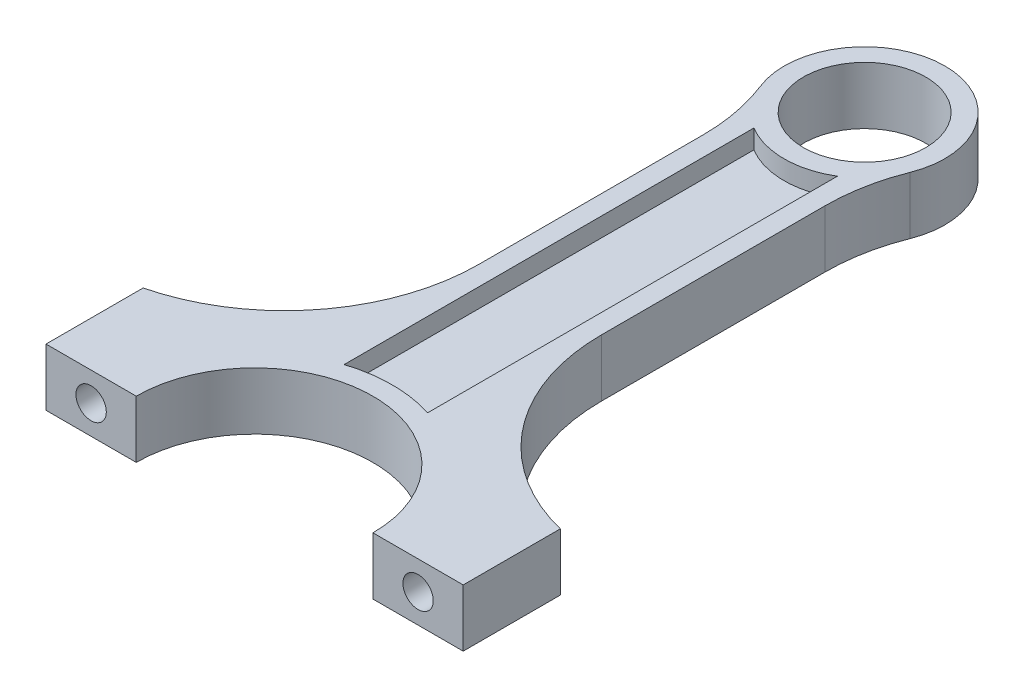
ISO-10303-21;
HEADER;
FILE_DESCRIPTION(('STEP AP214'),'2;1');
FILE_NAME('part.step','',(''),(''),'','','');
FILE_SCHEMA(('AUTOMOTIVE_DESIGN { 1 0 10303 214 1 1 1 1 }'));
ENDSEC;
DATA;
#1=APPLICATION_CONTEXT('core data for automotive mechanical design processes');
#2=APPLICATION_PROTOCOL_DEFINITION('international standard','automotive_design',2000,#1);
#3=PRODUCT_CONTEXT('',#1,'mechanical');
#4=PRODUCT('Part','Part','',(#3));
#5=PRODUCT_RELATED_PRODUCT_CATEGORY('part','',(#4));
#6=PRODUCT_DEFINITION_FORMATION('','',#4);
#7=PRODUCT_DEFINITION_CONTEXT('part definition',#1,'design');
#8=PRODUCT_DEFINITION('design','',#6,#7);
#9=PRODUCT_DEFINITION_SHAPE('','',#8);
#10=(LENGTH_UNIT() NAMED_UNIT(*) SI_UNIT(.MILLI.,.METRE.));
#11=(NAMED_UNIT(*) PLANE_ANGLE_UNIT() SI_UNIT($,.RADIAN.));
#12=(NAMED_UNIT(*) SI_UNIT($,.STERADIAN.) SOLID_ANGLE_UNIT());
#13=UNCERTAINTY_MEASURE_WITH_UNIT(LENGTH_MEASURE(1.E-05),#10,'distance_accuracy_value','');
#14=(GEOMETRIC_REPRESENTATION_CONTEXT(3) GLOBAL_UNCERTAINTY_ASSIGNED_CONTEXT((#13)) GLOBAL_UNIT_ASSIGNED_CONTEXT((#10,
#11,#12)) REPRESENTATION_CONTEXT('',''));
#15=CARTESIAN_POINT('',(0.,0.,0.));
#16=DIRECTION('',(0.,0.,1.));
#17=DIRECTION('',(1.,0.,0.));
#18=AXIS2_PLACEMENT_3D('',#15,#16,#17);
#19=CARTESIAN_POINT('',(0.,0.,0.));
#20=DIRECTION('',(0.,0.,1.));
#21=DIRECTION('',(1.,0.,0.));
#22=AXIS2_PLACEMENT_3D('',#19,#20,#21);
#23=PLANE('',#22);
#24=CARTESIAN_POINT('',(-42.7563512142864,0.,0.));
#25=DIRECTION('',(0.,0.,1.));
#26=DIRECTION('',(1.,0.,0.));
#27=AXIS2_PLACEMENT_3D('',#24,#25,#26);
#28=CIRCLE('',#27,3.96874999999999);
#29=CARTESIAN_POINT('',(-38.7876012142864,0.,0.));
#30=VERTEX_POINT('',#29);
#31=EDGE_CURVE('E194',#30,#30,#28,.T.);
#32=ORIENTED_EDGE('',*,*,#31,.F.);
#33=EDGE_LOOP('',(#32));
#34=FACE_BOUND('',#33,.T.);
#35=DIRECTION('',(0.,-1.,0.));
#36=VECTOR('',#35,1.);
#37=CARTESIAN_POINT('',(-54.5564524285727,-7.5057,0.));
#38=LINE('',#37,#36);
#39=CARTESIAN_POINT('',(-54.5564524285727,7.5057,0.));
#40=VERTEX_POINT('',#39);
#41=CARTESIAN_POINT('',(-54.5564524285727,-7.5057,0.));
#42=VERTEX_POINT('',#41);
#43=EDGE_CURVE('E333',#40,#42,#38,.T.);
#44=ORIENTED_EDGE('',*,*,#43,.T.);
#45=DIRECTION('',(1.,0.,0.));
#46=VECTOR('',#45,1.);
#47=CARTESIAN_POINT('',(0.,-7.5057,0.));
#48=LINE('',#47,#46);
#49=CARTESIAN_POINT('',(-30.95625,-7.5057,0.));
#50=VERTEX_POINT('',#49);
#51=EDGE_CURVE('E342',#42,#50,#48,.T.);
#52=ORIENTED_EDGE('',*,*,#51,.T.);
#53=DIRECTION('',(0.,1.,0.));
#54=VECTOR('',#53,1.);
#55=CARTESIAN_POINT('',(-30.95625,-7.5057,0.));
#56=LINE('',#55,#54);
#57=CARTESIAN_POINT('',(-30.95625,7.5057,0.));
#58=VERTEX_POINT('',#57);
#59=EDGE_CURVE('E339',#50,#58,#56,.T.);
#60=ORIENTED_EDGE('',*,*,#59,.T.);
#61=DIRECTION('',(1.,0.,0.));
#62=VECTOR('',#61,1.);
#63=CARTESIAN_POINT('',(0.,7.5057,0.));
#64=LINE('',#63,#62);
#65=EDGE_CURVE('E329',#40,#58,#64,.T.);
#66=ORIENTED_EDGE('',*,*,#65,.F.);
#67=EDGE_LOOP('',(#44,#52,#60,#66));
#68=FACE_BOUND('',#67,.T.);
#69=ADVANCED_FACE('F35',(#34,#68),#23,.T.);
#70=CARTESIAN_POINT('',(42.7563512142864,0.,0.));
#71=DIRECTION('',(0.,0.,1.));
#72=DIRECTION('',(1.,0.,0.));
#73=AXIS2_PLACEMENT_3D('',#70,#71,#72);
#74=CIRCLE('',#73,3.96874999999999);
#75=CARTESIAN_POINT('',(46.7251012142864,0.,0.));
#76=VERTEX_POINT('',#75);
#77=EDGE_CURVE('E193',#76,#76,#74,.T.);
#78=ORIENTED_EDGE('',*,*,#77,.F.);
#79=EDGE_LOOP('',(#78));
#80=FACE_BOUND('',#79,.T.);
#81=DIRECTION('',(0.,1.,0.));
#82=VECTOR('',#81,1.);
#83=CARTESIAN_POINT('',(30.95625,-7.5057,0.));
#84=LINE('',#83,#82);
#85=CARTESIAN_POINT('',(30.95625,7.5057,0.));
#86=VERTEX_POINT('',#85);
#87=CARTESIAN_POINT('',(30.95625,-7.5057,0.));
#88=VERTEX_POINT('',#87);
#89=EDGE_CURVE('E336',#86,#88,#84,.F.);
#90=ORIENTED_EDGE('',*,*,#89,.T.);
#91=CARTESIAN_POINT('',(54.5564524285727,-7.5057,0.));
#92=VERTEX_POINT('',#91);
#93=EDGE_CURVE('E204',#88,#92,#48,.T.);
#94=ORIENTED_EDGE('',*,*,#93,.T.);
#95=DIRECTION('',(0.,-1.,0.));
#96=VECTOR('',#95,1.);
#97=CARTESIAN_POINT('',(54.5564524285727,-7.5057,0.));
#98=LINE('',#97,#96);
#99=CARTESIAN_POINT('',(54.5564524285727,7.5057,0.));
#100=VERTEX_POINT('',#99);
#101=EDGE_CURVE('E330',#100,#92,#98,.T.);
#102=ORIENTED_EDGE('',*,*,#101,.F.);
#103=EDGE_CURVE('E224',#86,#100,#64,.T.);
#104=ORIENTED_EDGE('',*,*,#103,.F.);
#105=EDGE_LOOP('',(#90,#94,#102,#104));
#106=FACE_BOUND('',#105,.T.);
#107=ADVANCED_FACE('F382',(#80,#106),#23,.T.);
#108=CARTESIAN_POINT('',(0.,-2.54,0.));
#109=DIRECTION('',(0.,1.,0.));
#110=DIRECTION('',(0.,0.,1.));
#111=AXIS2_PLACEMENT_3D('',#108,#109,#110);
#112=PLANE('',#111);
#113=CARTESIAN_POINT('',(0.,-2.54,0.));
#114=DIRECTION('',(0.,1.,0.));
#115=DIRECTION('',(0.,0.,1.));
#116=AXIS2_PLACEMENT_3D('',#113,#114,#115);
#117=CIRCLE('',#116,36.03625);
#118=CARTESIAN_POINT('',(10.922,-2.54,-34.3412467750153));
#119=VERTEX_POINT('',#118);
#120=CARTESIAN_POINT('',(-10.922,-2.54,-34.3412467750153));
#121=VERTEX_POINT('',#120);
#122=EDGE_CURVE('E317',#119,#121,#117,.T.);
#123=ORIENTED_EDGE('',*,*,#122,.T.);
#124=DIRECTION('',(0.,0.,1.));
#125=VECTOR('',#124,1.);
#126=CARTESIAN_POINT('',(-10.922,-2.54,0.));
#127=LINE('',#126,#125);
#128=CARTESIAN_POINT('',(-10.922,-2.54,-141.511538821112));
#129=VERTEX_POINT('',#128);
#130=EDGE_CURVE('E72',#129,#121,#127,.T.);
#131=ORIENTED_EDGE('',*,*,#130,.F.);
#132=CARTESIAN_POINT('',(0.,-2.54,-159.54375));
#133=DIRECTION('',(0.,1.,0.));
#134=DIRECTION('',(0.,0.,1.));
#135=AXIS2_PLACEMENT_3D('',#132,#133,#134);
#136=CIRCLE('',#135,21.082);
#137=CARTESIAN_POINT('',(10.922,-2.54,-141.511538821112));
#138=VERTEX_POINT('',#137);
#139=EDGE_CURVE('E322',#129,#138,#136,.T.);
#140=ORIENTED_EDGE('',*,*,#139,.T.);
#141=DIRECTION('',(0.,0.,-1.));
#142=VECTOR('',#141,1.);
#143=CARTESIAN_POINT('',(10.922,-2.54,0.));
#144=LINE('',#143,#142);
#145=EDGE_CURVE('E308',#119,#138,#144,.T.);
#146=ORIENTED_EDGE('',*,*,#145,.F.);
#147=EDGE_LOOP('',(#123,#131,#140,#146));
#148=FACE_BOUND('',#147,.T.);
#149=ADVANCED_FACE('F413',(#148),#112,.F.);
#150=CARTESIAN_POINT('',(0.,2.54,0.));
#151=DIRECTION('',(0.,1.,0.));
#152=DIRECTION('',(0.,0.,1.));
#153=AXIS2_PLACEMENT_3D('',#150,#151,#152);
#154=PLANE('',#153);
#155=CARTESIAN_POINT('',(0.,2.54,0.));
#156=DIRECTION('',(0.,-1.,0.));
#157=DIRECTION('',(0.,0.,1.));
#158=AXIS2_PLACEMENT_3D('',#155,#156,#157);
#159=CIRCLE('',#158,36.03625);
#160=CARTESIAN_POINT('',(-10.922,2.54,-34.3412467750153));
#161=VERTEX_POINT('',#160);
#162=CARTESIAN_POINT('',(10.922,2.54,-34.3412467750153));
#163=VERTEX_POINT('',#162);
#164=EDGE_CURVE('E288',#161,#163,#159,.T.);
#165=ORIENTED_EDGE('',*,*,#164,.T.);
#166=DIRECTION('',(0.,0.,-1.));
#167=VECTOR('',#166,1.);
#168=CARTESIAN_POINT('',(10.922,2.54,-141.511538821112));
#169=LINE('',#168,#167);
#170=CARTESIAN_POINT('',(10.922,2.54,-141.511538821112));
#171=VERTEX_POINT('',#170);
#172=EDGE_CURVE('E301',#163,#171,#169,.T.);
#173=ORIENTED_EDGE('',*,*,#172,.T.);
#174=CARTESIAN_POINT('',(0.,2.54,-159.54375));
#175=DIRECTION('',(0.,-1.,0.));
#176=DIRECTION('',(0.,0.,1.));
#177=AXIS2_PLACEMENT_3D('',#174,#175,#176);
#178=CIRCLE('',#177,21.082);
#179=CARTESIAN_POINT('',(-10.922,2.54,-141.511538821112));
#180=VERTEX_POINT('',#179);
#181=EDGE_CURVE('E298',#171,#180,#178,.T.);
#182=ORIENTED_EDGE('',*,*,#181,.T.);
#183=DIRECTION('',(0.,0.,1.));
#184=VECTOR('',#183,1.);
#185=CARTESIAN_POINT('',(-10.922,2.54,-34.3412467750153));
#186=LINE('',#185,#184);
#187=EDGE_CURVE('E278',#180,#161,#186,.T.);
#188=ORIENTED_EDGE('',*,*,#187,.T.);
#189=EDGE_LOOP('',(#165,#173,#182,#188));
#190=FACE_BOUND('',#189,.T.);
#191=ADVANCED_FACE('F415',(#190),#154,.T.);
#192=CARTESIAN_POINT('',(0.,-2.54,-159.54375));
#193=DIRECTION('',(0.,-1.,0.));
#194=DIRECTION('',(0.,0.,-1.));
#195=AXIS2_PLACEMENT_3D('',#192,#193,#194);
#196=CYLINDRICAL_SURFACE('',#195,21.082);
#197=CARTESIAN_POINT('',(0.,-7.5057,-159.54375));
#198=DIRECTION('',(0.,1.,0.));
#199=DIRECTION('',(0.,0.,1.));
#200=AXIS2_PLACEMENT_3D('',#197,#198,#199);
#201=CIRCLE('',#200,21.082);
#202=CARTESIAN_POINT('',(-10.922,-7.5057,-141.511538821112));
#203=VERTEX_POINT('',#202);
#204=CARTESIAN_POINT('',(10.922,-7.5057,-141.511538821112));
#205=VERTEX_POINT('',#204);
#206=EDGE_CURVE('E316',#203,#205,#201,.T.);
#207=ORIENTED_EDGE('',*,*,#206,.T.);
#208=DIRECTION('',(0.,-1.,0.));
#209=VECTOR('',#208,1.);
#210=CARTESIAN_POINT('',(10.922,-2.54,-141.511538821112));
#211=LINE('',#210,#209);
#212=EDGE_CURVE('E310',#138,#205,#211,.T.);
#213=ORIENTED_EDGE('',*,*,#212,.F.);
#214=ORIENTED_EDGE('',*,*,#139,.F.);
#215=DIRECTION('',(0.,-1.,0.));
#216=VECTOR('',#215,1.);
#217=CARTESIAN_POINT('',(-10.922,-2.54,-141.511538821112));
#218=LINE('',#217,#216);
#219=EDGE_CURVE('E54',#129,#203,#218,.T.);
#220=ORIENTED_EDGE('',*,*,#219,.T.);
#221=EDGE_LOOP('',(#207,#213,#214,#220));
#222=FACE_BOUND('',#221,.T.);
#223=ADVANCED_FACE('F422',(#222),#196,.T.);
#224=CARTESIAN_POINT('',(10.922,-2.54,0.));
#225=DIRECTION('',(-1.,0.,0.));
#226=DIRECTION('',(0.,0.,1.));
#227=AXIS2_PLACEMENT_3D('',#224,#225,#226);
#228=PLANE('',#227);
#229=DIRECTION('',(0.,0.,-1.));
#230=VECTOR('',#229,1.);
#231=CARTESIAN_POINT('',(10.922,-7.5057,0.));
#232=LINE('',#231,#230);
#233=CARTESIAN_POINT('',(10.922,-7.5057,-34.3412467750153));
#234=VERTEX_POINT('',#233);
#235=EDGE_CURVE('E313',#234,#205,#232,.T.);
#236=ORIENTED_EDGE('',*,*,#235,.F.);
#237=DIRECTION('',(0.,-1.,0.));
#238=VECTOR('',#237,1.);
#239=CARTESIAN_POINT('',(10.922,-2.54,-34.3412467750153));
#240=LINE('',#239,#238);
#241=EDGE_CURVE('E77',#119,#234,#240,.T.);
#242=ORIENTED_EDGE('',*,*,#241,.F.);
#243=ORIENTED_EDGE('',*,*,#145,.T.);
#244=ORIENTED_EDGE('',*,*,#212,.T.);
#245=EDGE_LOOP('',(#236,#242,#243,#244));
#246=FACE_BOUND('',#245,.T.);
#247=ADVANCED_FACE('F429',(#246),#228,.T.);
#248=CARTESIAN_POINT('',(0.,-2.54,0.));
#249=DIRECTION('',(0.,-1.,0.));
#250=DIRECTION('',(0.,0.,-1.));
#251=AXIS2_PLACEMENT_3D('',#248,#249,#250);
#252=CYLINDRICAL_SURFACE('',#251,36.03625);
#253=CARTESIAN_POINT('',(0.,-7.5057,0.));
#254=DIRECTION('',(0.,1.,0.));
#255=DIRECTION('',(0.,0.,1.));
#256=AXIS2_PLACEMENT_3D('',#253,#254,#255);
#257=CIRCLE('',#256,36.03625);
#258=CARTESIAN_POINT('',(-10.922,-7.5057,-34.3412467750153));
#259=VERTEX_POINT('',#258);
#260=EDGE_CURVE('E11',#234,#259,#257,.T.);
#261=ORIENTED_EDGE('',*,*,#260,.T.);
#262=DIRECTION('',(0.,-1.,0.));
#263=VECTOR('',#262,1.);
#264=CARTESIAN_POINT('',(-10.922,-2.54,-34.3412467750153));
#265=LINE('',#264,#263);
#266=EDGE_CURVE('E306',#121,#259,#265,.T.);
#267=ORIENTED_EDGE('',*,*,#266,.F.);
#268=ORIENTED_EDGE('',*,*,#122,.F.);
#269=ORIENTED_EDGE('',*,*,#241,.T.);
#270=EDGE_LOOP('',(#261,#267,#268,#269));
#271=FACE_BOUND('',#270,.T.);
#272=ADVANCED_FACE('F455',(#271),#252,.T.);
#273=CARTESIAN_POINT('',(-10.922,-2.54,0.));
#274=DIRECTION('',(1.,0.,0.));
#275=DIRECTION('',(0.,0.,-1.));
#276=AXIS2_PLACEMENT_3D('',#273,#274,#275);
#277=PLANE('',#276);
#278=DIRECTION('',(0.,0.,1.));
#279=VECTOR('',#278,1.);
#280=CARTESIAN_POINT('',(-10.922,-7.5057,0.));
#281=LINE('',#280,#279);
#282=EDGE_CURVE('E45',#203,#259,#281,.T.);
#283=ORIENTED_EDGE('',*,*,#282,.F.);
#284=ORIENTED_EDGE('',*,*,#219,.F.);
#285=ORIENTED_EDGE('',*,*,#130,.T.);
#286=ORIENTED_EDGE('',*,*,#266,.T.);
#287=EDGE_LOOP('',(#283,#284,#285,#286));
#288=FACE_BOUND('',#287,.T.);
#289=ADVANCED_FACE('F454',(#288),#277,.T.);
#290=CARTESIAN_POINT('',(-66.802,-7.5057,-74.7019935162455));
#291=DIRECTION('',(0.,1.,0.));
#292=DIRECTION('',(0.,0.,1.));
#293=AXIS2_PLACEMENT_3D('',#290,#291,#292);
#294=CYLINDRICAL_SURFACE('',#293,50.8);
#295=DIRECTION('',(0.,1.,0.));
#296=VECTOR('',#295,1.);
#297=CARTESIAN_POINT('',(-54.5564524285727,-7.5057,-25.4));
#298=LINE('',#297,#296);
#299=CARTESIAN_POINT('',(-54.5564524285727,-7.5057,-25.4));
#300=VERTEX_POINT('',#299);
#301=CARTESIAN_POINT('',(-54.5564524285727,7.5057,-25.4));
#302=VERTEX_POINT('',#301);
#303=EDGE_CURVE('E210',#300,#302,#298,.T.);
#304=ORIENTED_EDGE('',*,*,#303,.T.);
#305=CARTESIAN_POINT('',(-66.802,7.5057,-74.7019935162455));
#306=DIRECTION('',(0.,1.,0.));
#307=DIRECTION('',(0.,0.,1.));
#308=AXIS2_PLACEMENT_3D('',#305,#306,#307);
#309=CIRCLE('',#308,50.8);
#310=CARTESIAN_POINT('',(-16.002,7.5057,-74.7019935162455));
#311=VERTEX_POINT('',#310);
#312=EDGE_CURVE('E265',#302,#311,#309,.T.);
#313=ORIENTED_EDGE('',*,*,#312,.T.);
#314=DIRECTION('',(0.,1.,0.));
#315=VECTOR('',#314,1.);
#316=CARTESIAN_POINT('',(-16.002,-7.5057,-74.7019935162455));
#317=LINE('',#316,#315);
#318=CARTESIAN_POINT('',(-16.002,-7.5057,-74.7019935162455));
#319=VERTEX_POINT('',#318);
#320=EDGE_CURVE('E208',#319,#311,#317,.T.);
#321=ORIENTED_EDGE('',*,*,#320,.F.);
#322=CARTESIAN_POINT('',(-66.802,-7.5057,-74.7019935162455));
#323=DIRECTION('',(0.,1.,0.));
#324=DIRECTION('',(0.,0.,1.));
#325=AXIS2_PLACEMENT_3D('',#322,#323,#324);
#326=CIRCLE('',#325,50.8);
#327=EDGE_CURVE('E240',#300,#319,#326,.T.);
#328=ORIENTED_EDGE('',*,*,#327,.F.);
#329=EDGE_LOOP('',(#304,#313,#321,#328));
#330=FACE_BOUND('',#329,.T.);
#331=ADVANCED_FACE('F359',(#330),#294,.F.);
#332=CARTESIAN_POINT('',(-16.002,-7.5057,0.));
#333=DIRECTION('',(-1.,0.,0.));
#334=DIRECTION('',(0.,0.,1.));
#335=AXIS2_PLACEMENT_3D('',#332,#333,#334);
#336=PLANE('',#335);
#337=ORIENTED_EDGE('',*,*,#320,.T.);
#338=DIRECTION('',(0.,0.,1.));
#339=VECTOR('',#338,1.);
#340=CARTESIAN_POINT('',(-16.002,7.5057,0.));
#341=LINE('',#340,#339);
#342=CARTESIAN_POINT('',(-16.002,7.5057,-133.218476971976));
#343=VERTEX_POINT('',#342);
#344=EDGE_CURVE('E268',#343,#311,#341,.T.);
#345=ORIENTED_EDGE('',*,*,#344,.F.);
#346=DIRECTION('',(0.,1.,0.));
#347=VECTOR('',#346,1.);
#348=CARTESIAN_POINT('',(-16.002,-7.5057,-133.218476971976));
#349=LINE('',#348,#347);
#350=CARTESIAN_POINT('',(-16.002,-7.5057,-133.218476971976));
#351=VERTEX_POINT('',#350);
#352=EDGE_CURVE('E205',#351,#343,#349,.T.);
#353=ORIENTED_EDGE('',*,*,#352,.F.);
#354=DIRECTION('',(0.,0.,1.));
#355=VECTOR('',#354,1.);
#356=CARTESIAN_POINT('',(-16.002,-7.5057,0.));
#357=LINE('',#356,#355);
#358=EDGE_CURVE('E242',#351,#319,#357,.T.);
#359=ORIENTED_EDGE('',*,*,#358,.T.);
#360=EDGE_LOOP('',(#337,#345,#353,#359));
#361=FACE_BOUND('',#360,.T.);
#362=ADVANCED_FACE('F364',(#361),#336,.T.);
#363=CARTESIAN_POINT('',(-66.802,-7.5057,-133.218476971976));
#364=DIRECTION('',(0.,1.,0.));
#365=DIRECTION('',(0.,0.,1.));
#366=AXIS2_PLACEMENT_3D('',#363,#364,#365);
#367=CYLINDRICAL_SURFACE('',#366,50.8);
#368=ORIENTED_EDGE('',*,*,#352,.T.);
#369=CARTESIAN_POINT('',(-66.802,7.5057,-133.218476971976));
#370=DIRECTION('',(0.,1.,0.));
#371=DIRECTION('',(0.,0.,1.));
#372=AXIS2_PLACEMENT_3D('',#369,#370,#371);
#373=CIRCLE('',#372,50.8);
#374=CARTESIAN_POINT('',(-19.5395059190552,7.5057,-151.843638803452));
#375=VERTEX_POINT('',#374);
#376=EDGE_CURVE('E271',#343,#375,#373,.T.);
#377=ORIENTED_EDGE('',*,*,#376,.T.);
#378=DIRECTION('',(0.,1.,0.));
#379=VECTOR('',#378,1.);
#380=CARTESIAN_POINT('',(-19.5395059190552,-7.5057,-151.843638803452));
#381=LINE('',#380,#379);
#382=CARTESIAN_POINT('',(-19.5395059190552,-7.5057,-151.843638803452));
#383=VERTEX_POINT('',#382);
#384=EDGE_CURVE('E222',#383,#375,#381,.T.);
#385=ORIENTED_EDGE('',*,*,#384,.F.);
#386=CARTESIAN_POINT('',(-66.802,-7.5057,-133.218476971976));
#387=DIRECTION('',(0.,1.,0.));
#388=DIRECTION('',(0.,0.,1.));
#389=AXIS2_PLACEMENT_3D('',#386,#387,#388);
#390=CIRCLE('',#389,50.8);
#391=EDGE_CURVE('E246',#351,#383,#390,.T.);
#392=ORIENTED_EDGE('',*,*,#391,.F.);
#393=EDGE_LOOP('',(#368,#377,#385,#392));
#394=FACE_BOUND('',#393,.T.);
#395=ADVANCED_FACE('F403',(#394),#367,.F.);
#396=CARTESIAN_POINT('',(0.,-7.5057,-159.54375));
#397=DIRECTION('',(0.,1.,0.));
#398=DIRECTION('',(0.,0.,1.));
#399=AXIS2_PLACEMENT_3D('',#396,#397,#398);
#400=CYLINDRICAL_SURFACE('',#399,21.002);
#401=ORIENTED_EDGE('',*,*,#384,.T.);
#402=CARTESIAN_POINT('',(0.,7.5057,-159.54375));
#403=DIRECTION('',(0.,1.,0.));
#404=DIRECTION('',(0.,0.,1.));
#405=AXIS2_PLACEMENT_3D('',#402,#403,#404);
#406=CIRCLE('',#405,21.002);
#407=CARTESIAN_POINT('',(19.5395059190552,7.5057,-151.843638803452));
#408=VERTEX_POINT('',#407);
#409=EDGE_CURVE('E252',#408,#375,#406,.T.);
#410=ORIENTED_EDGE('',*,*,#409,.F.);
#411=DIRECTION('',(0.,1.,0.));
#412=VECTOR('',#411,1.);
#413=CARTESIAN_POINT('',(19.5395059190552,-7.5057,-151.843638803452));
#414=LINE('',#413,#412);
#415=CARTESIAN_POINT('',(19.5395059190552,-7.5057,-151.843638803452));
#416=VERTEX_POINT('',#415);
#417=EDGE_CURVE('E220',#416,#408,#414,.T.);
#418=ORIENTED_EDGE('',*,*,#417,.F.);
#419=CARTESIAN_POINT('',(0.,-7.5057,-159.54375));
#420=DIRECTION('',(0.,1.,0.));
#421=DIRECTION('',(0.,0.,1.));
#422=AXIS2_PLACEMENT_3D('',#419,#420,#421);
#423=CIRCLE('',#422,21.002);
#424=EDGE_CURVE('E228',#416,#383,#423,.T.);
#425=ORIENTED_EDGE('',*,*,#424,.T.);
#426=EDGE_LOOP('',(#401,#410,#418,#425));
#427=FACE_BOUND('',#426,.T.);
#428=ADVANCED_FACE('F401',(#427),#400,.T.);
#429=CARTESIAN_POINT('',(66.802,-7.5057,-133.218476971976));
#430=DIRECTION('',(0.,1.,0.));
#431=DIRECTION('',(0.,0.,1.));
#432=AXIS2_PLACEMENT_3D('',#429,#430,#431);
#433=CYLINDRICAL_SURFACE('',#432,50.8);
#434=ORIENTED_EDGE('',*,*,#417,.T.);
#435=CARTESIAN_POINT('',(66.802,7.5057,-133.218476971976));
#436=DIRECTION('',(0.,1.,0.));
#437=DIRECTION('',(0.,0.,1.));
#438=AXIS2_PLACEMENT_3D('',#435,#436,#437);
#439=CIRCLE('',#438,50.8);
#440=CARTESIAN_POINT('',(16.002,7.5057,-133.218476971976));
#441=VERTEX_POINT('',#440);
#442=EDGE_CURVE('E255',#441,#408,#439,.F.);
#443=ORIENTED_EDGE('',*,*,#442,.F.);
#444=DIRECTION('',(0.,1.,0.));
#445=VECTOR('',#444,1.);
#446=CARTESIAN_POINT('',(16.002,-7.5057,-133.218476971976));
#447=LINE('',#446,#445);
#448=CARTESIAN_POINT('',(16.002,-7.5057,-133.218476971976));
#449=VERTEX_POINT('',#448);
#450=EDGE_CURVE('E218',#449,#441,#447,.T.);
#451=ORIENTED_EDGE('',*,*,#450,.F.);
#452=CARTESIAN_POINT('',(66.802,-7.5057,-133.218476971976));
#453=DIRECTION('',(0.,1.,0.));
#454=DIRECTION('',(0.,0.,1.));
#455=AXIS2_PLACEMENT_3D('',#452,#453,#454);
#456=CIRCLE('',#455,50.8);
#457=EDGE_CURVE('E231',#449,#416,#456,.F.);
#458=ORIENTED_EDGE('',*,*,#457,.T.);
#459=EDGE_LOOP('',(#434,#443,#451,#458));
#460=FACE_BOUND('',#459,.T.);
#461=ADVANCED_FACE('F398',(#460),#433,.F.);
#462=CARTESIAN_POINT('',(16.002,-7.5057,0.));
#463=DIRECTION('',(-1.,0.,0.));
#464=DIRECTION('',(0.,0.,1.));
#465=AXIS2_PLACEMENT_3D('',#462,#463,#464);
#466=PLANE('',#465);
#467=ORIENTED_EDGE('',*,*,#450,.T.);
#468=DIRECTION('',(0.,0.,1.));
#469=VECTOR('',#468,1.);
#470=CARTESIAN_POINT('',(16.002,7.5057,0.));
#471=LINE('',#470,#469);
#472=CARTESIAN_POINT('',(16.002,7.5057,-74.7019935162455));
#473=VERTEX_POINT('',#472);
#474=EDGE_CURVE('E258',#441,#473,#471,.T.);
#475=ORIENTED_EDGE('',*,*,#474,.T.);
#476=DIRECTION('',(0.,1.,0.));
#477=VECTOR('',#476,1.);
#478=CARTESIAN_POINT('',(16.002,-7.5057,-74.7019935162455));
#479=LINE('',#478,#477);
#480=CARTESIAN_POINT('',(16.002,-7.5057,-74.7019935162455));
#481=VERTEX_POINT('',#480);
#482=EDGE_CURVE('E216',#481,#473,#479,.T.);
#483=ORIENTED_EDGE('',*,*,#482,.F.);
#484=DIRECTION('',(0.,0.,1.));
#485=VECTOR('',#484,1.);
#486=CARTESIAN_POINT('',(16.002,-7.5057,0.));
#487=LINE('',#486,#485);
#488=EDGE_CURVE('E234',#449,#481,#487,.T.);
#489=ORIENTED_EDGE('',*,*,#488,.F.);
#490=EDGE_LOOP('',(#467,#475,#483,#489));
#491=FACE_BOUND('',#490,.T.);
#492=ADVANCED_FACE('F393',(#491),#466,.F.);
#493=CARTESIAN_POINT('',(66.802,-7.5057,-74.7019935162455));
#494=DIRECTION('',(0.,1.,0.));
#495=DIRECTION('',(0.,0.,1.));
#496=AXIS2_PLACEMENT_3D('',#493,#494,#495);
#497=CYLINDRICAL_SURFACE('',#496,50.8);
#498=ORIENTED_EDGE('',*,*,#482,.T.);
#499=CARTESIAN_POINT('',(66.802,7.5057,-74.7019935162455));
#500=DIRECTION('',(0.,1.,0.));
#501=DIRECTION('',(0.,0.,1.));
#502=AXIS2_PLACEMENT_3D('',#499,#500,#501);
#503=CIRCLE('',#502,50.8);
#504=CARTESIAN_POINT('',(54.5564524285727,7.5057,-25.4));
#505=VERTEX_POINT('',#504);
#506=EDGE_CURVE('E261',#505,#473,#503,.F.);
#507=ORIENTED_EDGE('',*,*,#506,.F.);
#508=DIRECTION('',(0.,1.,0.));
#509=VECTOR('',#508,1.);
#510=CARTESIAN_POINT('',(54.5564524285727,-7.5057,-25.4));
#511=LINE('',#510,#509);
#512=CARTESIAN_POINT('',(54.5564524285727,-7.5057,-25.4));
#513=VERTEX_POINT('',#512);
#514=EDGE_CURVE('E213',#513,#505,#511,.T.);
#515=ORIENTED_EDGE('',*,*,#514,.F.);
#516=CARTESIAN_POINT('',(66.802,-7.5057,-74.7019935162455));
#517=DIRECTION('',(0.,1.,0.));
#518=DIRECTION('',(0.,0.,1.));
#519=AXIS2_PLACEMENT_3D('',#516,#517,#518);
#520=CIRCLE('',#519,50.8);
#521=EDGE_CURVE('E236',#513,#481,#520,.F.);
#522=ORIENTED_EDGE('',*,*,#521,.T.);
#523=EDGE_LOOP('',(#498,#507,#515,#522));
#524=FACE_BOUND('',#523,.T.);
#525=ADVANCED_FACE('F389',(#524),#497,.F.);
#526=CARTESIAN_POINT('',(54.5564524285727,-7.5057,0.));
#527=DIRECTION('',(1.,0.,0.));
#528=DIRECTION('',(0.,0.,-1.));
#529=AXIS2_PLACEMENT_3D('',#526,#527,#528);
#530=PLANE('',#529);
#531=DIRECTION('',(0.,0.,-1.));
#532=VECTOR('',#531,1.);
#533=CARTESIAN_POINT('',(54.5564524285727,7.5057,0.));
#534=LINE('',#533,#532);
#535=EDGE_CURVE('E264',#100,#505,#534,.T.);
#536=ORIENTED_EDGE('',*,*,#535,.F.);
#537=ORIENTED_EDGE('',*,*,#101,.T.);
#538=DIRECTION('',(0.,0.,-1.));
#539=VECTOR('',#538,1.);
#540=CARTESIAN_POINT('',(54.5564524285727,-7.5057,0.));
#541=LINE('',#540,#539);
#542=EDGE_CURVE('E239',#92,#513,#541,.T.);
#543=ORIENTED_EDGE('',*,*,#542,.T.);
#544=ORIENTED_EDGE('',*,*,#514,.T.);
#545=EDGE_LOOP('',(#536,#537,#543,#544));
#546=FACE_BOUND('',#545,.T.);
#547=ADVANCED_FACE('F386',(#546),#530,.T.);
#548=CARTESIAN_POINT('',(0.,-7.5057,0.));
#549=DIRECTION('',(0.,1.,0.));
#550=DIRECTION('',(0.,0.,1.));
#551=AXIS2_PLACEMENT_3D('',#548,#549,#550);
#552=CYLINDRICAL_SURFACE('',#551,30.95625);
#553=ORIENTED_EDGE('',*,*,#89,.F.);
#554=CARTESIAN_POINT('',(0.,7.5057,0.));
#555=DIRECTION('',(0.,1.,0.));
#556=DIRECTION('',(0.,0.,1.));
#557=AXIS2_PLACEMENT_3D('',#554,#555,#556);
#558=CIRCLE('',#557,30.95625);
#559=EDGE_CURVE('E248',#86,#58,#558,.T.);
#560=ORIENTED_EDGE('',*,*,#559,.T.);
#561=ORIENTED_EDGE('',*,*,#59,.F.);
#562=CARTESIAN_POINT('',(0.,-7.5057,0.));
#563=DIRECTION('',(0.,1.,0.));
#564=DIRECTION('',(0.,0.,1.));
#565=AXIS2_PLACEMENT_3D('',#562,#563,#564);
#566=CIRCLE('',#565,30.95625);
#567=EDGE_CURVE('E207',#88,#50,#566,.T.);
#568=ORIENTED_EDGE('',*,*,#567,.F.);
#569=EDGE_LOOP('',(#553,#560,#561,#568));
#570=FACE_BOUND('',#569,.T.);
#571=ADVANCED_FACE('F379',(#570),#552,.F.);
#572=CARTESIAN_POINT('',(-54.5564524285727,-7.5057,0.));
#573=DIRECTION('',(1.,0.,0.));
#574=DIRECTION('',(0.,0.,-1.));
#575=AXIS2_PLACEMENT_3D('',#572,#573,#574);
#576=PLANE('',#575);
#577=ORIENTED_EDGE('',*,*,#43,.F.);
#578=DIRECTION('',(0.,0.,-1.));
#579=VECTOR('',#578,1.);
#580=CARTESIAN_POINT('',(-54.5564524285727,7.5057,0.));
#581=LINE('',#580,#579);
#582=EDGE_CURVE('E39',#40,#302,#581,.T.);
#583=ORIENTED_EDGE('',*,*,#582,.T.);
#584=ORIENTED_EDGE('',*,*,#303,.F.);
#585=DIRECTION('',(0.,0.,-1.));
#586=VECTOR('',#585,1.);
#587=CARTESIAN_POINT('',(-54.5564524285727,-7.5057,0.));
#588=LINE('',#587,#586);
#589=EDGE_CURVE('E243',#42,#300,#588,.T.);
#590=ORIENTED_EDGE('',*,*,#589,.F.);
#591=EDGE_LOOP('',(#577,#583,#584,#590));
#592=FACE_BOUND('',#591,.T.);
#593=ADVANCED_FACE('F355',(#592),#576,.F.);
#594=CARTESIAN_POINT('',(0.,-7.5057,-159.54375));
#595=DIRECTION('',(0.,1.,0.));
#596=DIRECTION('',(0.,0.,1.));
#597=AXIS2_PLACEMENT_3D('',#594,#595,#596);
#598=CYLINDRICAL_SURFACE('',#597,16.002);
#599=CARTESIAN_POINT('',(0.,-7.5057,-159.54375));
#600=DIRECTION('',(0.,1.,0.));
#601=DIRECTION('',(0.,0.,1.));
#602=AXIS2_PLACEMENT_3D('',#599,#600,#601);
#603=CIRCLE('',#602,16.002);
#604=CARTESIAN_POINT('',(0.,-7.5057,-143.54175));
#605=VERTEX_POINT('',#604);
#606=EDGE_CURVE('E225',#605,#605,#603,.T.);
#607=ORIENTED_EDGE('',*,*,#606,.F.);
#608=EDGE_LOOP('',(#607));
#609=FACE_BOUND('',#608,.T.);
#610=CARTESIAN_POINT('',(0.,7.5057,-159.54375));
#611=DIRECTION('',(0.,1.,0.));
#612=DIRECTION('',(0.,0.,1.));
#613=AXIS2_PLACEMENT_3D('',#610,#611,#612);
#614=CIRCLE('',#613,16.002);
#615=CARTESIAN_POINT('',(0.,7.5057,-143.54175));
#616=VERTEX_POINT('',#615);
#617=EDGE_CURVE('E249',#616,#616,#614,.T.);
#618=ORIENTED_EDGE('',*,*,#617,.T.);
#619=EDGE_LOOP('',(#618));
#620=FACE_BOUND('',#619,.T.);
#621=ADVANCED_FACE('F439',(#609,#620),#598,.F.);
#622=CARTESIAN_POINT('',(10.922,2.54,-141.511538821112));
#623=DIRECTION('',(1.,0.,0.));
#624=DIRECTION('',(0.,0.,-1.));
#625=AXIS2_PLACEMENT_3D('',#622,#623,#624);
#626=PLANE('',#625);
#627=DIRECTION('',(0.,0.,-1.));
#628=VECTOR('',#627,1.);
#629=CARTESIAN_POINT('',(10.922,7.5057,-141.511538821112));
#630=LINE('',#629,#628);
#631=CARTESIAN_POINT('',(10.922,7.5057,-34.3412467750153));
#632=VERTEX_POINT('',#631);
#633=CARTESIAN_POINT('',(10.922,7.5057,-141.511538821112));
#634=VERTEX_POINT('',#633);
#635=EDGE_CURVE('E291',#632,#634,#630,.T.);
#636=ORIENTED_EDGE('',*,*,#635,.T.);
#637=DIRECTION('',(0.,1.,0.));
#638=VECTOR('',#637,1.);
#639=CARTESIAN_POINT('',(10.922,2.54,-141.511538821112));
#640=LINE('',#639,#638);
#641=EDGE_CURVE('E279',#171,#634,#640,.T.);
#642=ORIENTED_EDGE('',*,*,#641,.F.);
#643=ORIENTED_EDGE('',*,*,#172,.F.);
#644=DIRECTION('',(0.,1.,0.));
#645=VECTOR('',#644,1.);
#646=CARTESIAN_POINT('',(10.922,2.54,-34.3412467750153));
#647=LINE('',#646,#645);
#648=EDGE_CURVE('E275',#163,#632,#647,.T.);
#649=ORIENTED_EDGE('',*,*,#648,.T.);
#650=EDGE_LOOP('',(#636,#642,#643,#649));
#651=FACE_BOUND('',#650,.T.);
#652=ADVANCED_FACE('F475',(#651),#626,.F.);
#653=CARTESIAN_POINT('',(0.,2.54,-159.54375));
#654=DIRECTION('',(0.,1.,0.));
#655=DIRECTION('',(0.,0.,1.));
#656=AXIS2_PLACEMENT_3D('',#653,#654,#655);
#657=CYLINDRICAL_SURFACE('',#656,21.082);
#658=CARTESIAN_POINT('',(0.,7.5057,-159.54375));
#659=DIRECTION('',(0.,-1.,0.));
#660=DIRECTION('',(0.,0.,1.));
#661=AXIS2_PLACEMENT_3D('',#658,#659,#660);
#662=CIRCLE('',#661,21.082);
#663=CARTESIAN_POINT('',(-10.922,7.5057,-141.511538821112));
#664=VERTEX_POINT('',#663);
#665=EDGE_CURVE('E287',#634,#664,#662,.T.);
#666=ORIENTED_EDGE('',*,*,#665,.T.);
#667=DIRECTION('',(0.,1.,0.));
#668=VECTOR('',#667,1.);
#669=CARTESIAN_POINT('',(-10.922,2.54,-141.511538821112));
#670=LINE('',#669,#668);
#671=EDGE_CURVE('E281',#180,#664,#670,.T.);
#672=ORIENTED_EDGE('',*,*,#671,.F.);
#673=ORIENTED_EDGE('',*,*,#181,.F.);
#674=ORIENTED_EDGE('',*,*,#641,.T.);
#675=EDGE_LOOP('',(#666,#672,#673,#674));
#676=FACE_BOUND('',#675,.T.);
#677=ADVANCED_FACE('F471',(#676),#657,.T.);
#678=CARTESIAN_POINT('',(-10.922,2.54,-34.3412467750153));
#679=DIRECTION('',(-1.,0.,0.));
#680=DIRECTION('',(0.,0.,1.));
#681=AXIS2_PLACEMENT_3D('',#678,#679,#680);
#682=PLANE('',#681);
#683=DIRECTION('',(0.,0.,1.));
#684=VECTOR('',#683,1.);
#685=CARTESIAN_POINT('',(-10.922,7.5057,-34.3412467750153));
#686=LINE('',#685,#684);
#687=CARTESIAN_POINT('',(-10.922,7.5057,-34.3412467750153));
#688=VERTEX_POINT('',#687);
#689=EDGE_CURVE('E284',#664,#688,#686,.T.);
#690=ORIENTED_EDGE('',*,*,#689,.T.);
#691=DIRECTION('',(0.,1.,0.));
#692=VECTOR('',#691,1.);
#693=CARTESIAN_POINT('',(-10.922,2.54,-34.3412467750153));
#694=LINE('',#693,#692);
#695=EDGE_CURVE('E274',#161,#688,#694,.T.);
#696=ORIENTED_EDGE('',*,*,#695,.F.);
#697=ORIENTED_EDGE('',*,*,#187,.F.);
#698=ORIENTED_EDGE('',*,*,#671,.T.);
#699=EDGE_LOOP('',(#690,#696,#697,#698));
#700=FACE_BOUND('',#699,.T.);
#701=ADVANCED_FACE('F468',(#700),#682,.F.);
#702=CARTESIAN_POINT('',(0.,2.54,0.));
#703=DIRECTION('',(0.,1.,0.));
#704=DIRECTION('',(0.,0.,1.));
#705=AXIS2_PLACEMENT_3D('',#702,#703,#704);
#706=CYLINDRICAL_SURFACE('',#705,36.03625);
#707=CARTESIAN_POINT('',(0.,7.5057,0.));
#708=DIRECTION('',(0.,-1.,0.));
#709=DIRECTION('',(0.,0.,1.));
#710=AXIS2_PLACEMENT_3D('',#707,#708,#709);
#711=CIRCLE('',#710,36.03625);
#712=EDGE_CURVE('E294',#688,#632,#711,.T.);
#713=ORIENTED_EDGE('',*,*,#712,.T.);
#714=ORIENTED_EDGE('',*,*,#648,.F.);
#715=ORIENTED_EDGE('',*,*,#164,.F.);
#716=ORIENTED_EDGE('',*,*,#695,.T.);
#717=EDGE_LOOP('',(#713,#714,#715,#716));
#718=FACE_BOUND('',#717,.T.);
#719=ADVANCED_FACE('F448',(#718),#706,.T.);
#720=CARTESIAN_POINT('',(0.,7.5057,0.));
#721=DIRECTION('',(0.,1.,0.));
#722=DIRECTION('',(0.,0.,1.));
#723=AXIS2_PLACEMENT_3D('',#720,#721,#722);
#724=PLANE('',#723);
#725=ORIENTED_EDGE('',*,*,#712,.F.);
#726=ORIENTED_EDGE('',*,*,#689,.F.);
#727=ORIENTED_EDGE('',*,*,#665,.F.);
#728=ORIENTED_EDGE('',*,*,#635,.F.);
#729=EDGE_LOOP('',(#725,#726,#727,#728));
#730=FACE_BOUND('',#729,.T.);
#731=ORIENTED_EDGE('',*,*,#617,.F.);
#732=EDGE_LOOP('',(#731));
#733=FACE_BOUND('',#732,.T.);
#734=ORIENTED_EDGE('',*,*,#582,.F.);
#735=ORIENTED_EDGE('',*,*,#65,.T.);
#736=ORIENTED_EDGE('',*,*,#559,.F.);
#737=ORIENTED_EDGE('',*,*,#103,.T.);
#738=ORIENTED_EDGE('',*,*,#535,.T.);
#739=ORIENTED_EDGE('',*,*,#506,.T.);
#740=ORIENTED_EDGE('',*,*,#474,.F.);
#741=ORIENTED_EDGE('',*,*,#442,.T.);
#742=ORIENTED_EDGE('',*,*,#409,.T.);
#743=ORIENTED_EDGE('',*,*,#376,.F.);
#744=ORIENTED_EDGE('',*,*,#344,.T.);
#745=ORIENTED_EDGE('',*,*,#312,.F.);
#746=EDGE_LOOP('',(#734,#735,#736,#737,#738,#739,#740,#741,#742,#743,#744,#745));
#747=FACE_BOUND('',#746,.T.);
#748=ADVANCED_FACE('F37',(#730,#733,#747),#724,.T.);
#749=CARTESIAN_POINT('',(0.,-7.5057,0.));
#750=DIRECTION('',(0.,1.,0.));
#751=DIRECTION('',(0.,0.,1.));
#752=AXIS2_PLACEMENT_3D('',#749,#750,#751);
#753=PLANE('',#752);
#754=ORIENTED_EDGE('',*,*,#606,.T.);
#755=EDGE_LOOP('',(#754));
#756=FACE_BOUND('',#755,.T.);
#757=ORIENTED_EDGE('',*,*,#282,.T.);
#758=ORIENTED_EDGE('',*,*,#260,.F.);
#759=ORIENTED_EDGE('',*,*,#235,.T.);
#760=ORIENTED_EDGE('',*,*,#206,.F.);
#761=EDGE_LOOP('',(#757,#758,#759,#760));
#762=FACE_BOUND('',#761,.T.);
#763=ORIENTED_EDGE('',*,*,#51,.F.);
#764=ORIENTED_EDGE('',*,*,#589,.T.);
#765=ORIENTED_EDGE('',*,*,#327,.T.);
#766=ORIENTED_EDGE('',*,*,#358,.F.);
#767=ORIENTED_EDGE('',*,*,#391,.T.);
#768=ORIENTED_EDGE('',*,*,#424,.F.);
#769=ORIENTED_EDGE('',*,*,#457,.F.);
#770=ORIENTED_EDGE('',*,*,#488,.T.);
#771=ORIENTED_EDGE('',*,*,#521,.F.);
#772=ORIENTED_EDGE('',*,*,#542,.F.);
#773=ORIENTED_EDGE('',*,*,#93,.F.);
#774=ORIENTED_EDGE('',*,*,#567,.T.);
#775=EDGE_LOOP('',(#763,#764,#765,#766,#767,#768,#769,#770,#771,#772,#773,#774));
#776=FACE_BOUND('',#775,.T.);
#777=ADVANCED_FACE('F369',(#756,#762,#776),#753,.F.);
#778=CARTESIAN_POINT('',(42.7563512142864,0.,-19.05));
#779=DIRECTION('',(0.,0.,1.));
#780=DIRECTION('',(1.,0.,0.));
#781=AXIS2_PLACEMENT_3D('',#778,#779,#780);
#782=CONICAL_SURFACE('',#781,3.96874999999999,1.02974425867665);
#783=CARTESIAN_POINT('',(42.7563512142864,0.,-21.4346655817656));
#784=VERTEX_POINT('',#783);
#785=VERTEX_LOOP('',#784);
#786=FACE_BOUND('',#785,.T.);
#787=CARTESIAN_POINT('',(42.7563512142864,0.,-19.05));
#788=DIRECTION('',(0.,0.,1.));
#789=DIRECTION('',(1.,0.,0.));
#790=AXIS2_PLACEMENT_3D('',#787,#788,#789);
#791=CIRCLE('',#790,3.96874999999999);
#792=CARTESIAN_POINT('',(46.7251012142864,0.,-19.05));
#793=VERTEX_POINT('',#792);
#794=EDGE_CURVE('E197',#793,#793,#791,.T.);
#795=ORIENTED_EDGE('',*,*,#794,.T.);
#796=EDGE_LOOP('',(#795));
#797=FACE_BOUND('',#796,.T.);
#798=ADVANCED_FACE('F434',(#786,#797),#782,.F.);
#799=CARTESIAN_POINT('',(42.7563512142864,0.,0.));
#800=DIRECTION('',(0.,0.,1.));
#801=DIRECTION('',(1.,0.,0.));
#802=AXIS2_PLACEMENT_3D('',#799,#800,#801);
#803=CYLINDRICAL_SURFACE('',#802,3.96874999999999);
#804=ORIENTED_EDGE('',*,*,#794,.F.);
#805=EDGE_LOOP('',(#804));
#806=FACE_BOUND('',#805,.T.);
#807=ORIENTED_EDGE('',*,*,#77,.T.);
#808=EDGE_LOOP('',(#807));
#809=FACE_BOUND('',#808,.T.);
#810=ADVANCED_FACE('F187',(#806,#809),#803,.F.);
#811=CARTESIAN_POINT('',(-42.7563512142864,0.,-19.05));
#812=DIRECTION('',(0.,0.,1.));
#813=DIRECTION('',(1.,0.,0.));
#814=AXIS2_PLACEMENT_3D('',#811,#812,#813);
#815=CONICAL_SURFACE('',#814,3.96874999999999,1.02974425867665);
#816=CARTESIAN_POINT('',(-42.7563512142864,0.,-21.4346655817656));
#817=VERTEX_POINT('',#816);
#818=VERTEX_LOOP('',#817);
#819=FACE_BOUND('',#818,.T.);
#820=CARTESIAN_POINT('',(-42.7563512142864,0.,-19.05));
#821=DIRECTION('',(0.,0.,1.));
#822=DIRECTION('',(1.,0.,0.));
#823=AXIS2_PLACEMENT_3D('',#820,#821,#822);
#824=CIRCLE('',#823,3.96874999999999);
#825=CARTESIAN_POINT('',(-38.7876012142864,0.,-19.05));
#826=VERTEX_POINT('',#825);
#827=EDGE_CURVE('E191',#826,#826,#824,.T.);
#828=ORIENTED_EDGE('',*,*,#827,.T.);
#829=EDGE_LOOP('',(#828));
#830=FACE_BOUND('',#829,.T.);
#831=ADVANCED_FACE('F183',(#819,#830),#815,.F.);
#832=CARTESIAN_POINT('',(-42.7563512142864,0.,0.));
#833=DIRECTION('',(0.,0.,1.));
#834=DIRECTION('',(1.,0.,0.));
#835=AXIS2_PLACEMENT_3D('',#832,#833,#834);
#836=CYLINDRICAL_SURFACE('',#835,3.96874999999999);
#837=ORIENTED_EDGE('',*,*,#827,.F.);
#838=EDGE_LOOP('',(#837));
#839=FACE_BOUND('',#838,.T.);
#840=ORIENTED_EDGE('',*,*,#31,.T.);
#841=EDGE_LOOP('',(#840));
#842=FACE_BOUND('',#841,.T.);
#843=ADVANCED_FACE('F186',(#839,#842),#836,.F.);
#844=CLOSED_SHELL('',(#69,#107,#149,#191,#223,#247,#272,#289,#331,#362,#395,#428,#461,#492,#525,
#547,#571,#593,#621,#652,#677,#701,#719,#748,#777,#798,#810,#831,#843));
#845=MANIFOLD_SOLID_BREP('B2',#844);
#846=ADVANCED_BREP_SHAPE_REPRESENTATION('',(#18,#845),#14);
#847=SHAPE_DEFINITION_REPRESENTATION(#9,#846);
ENDSEC;
END-ISO-10303-21;
